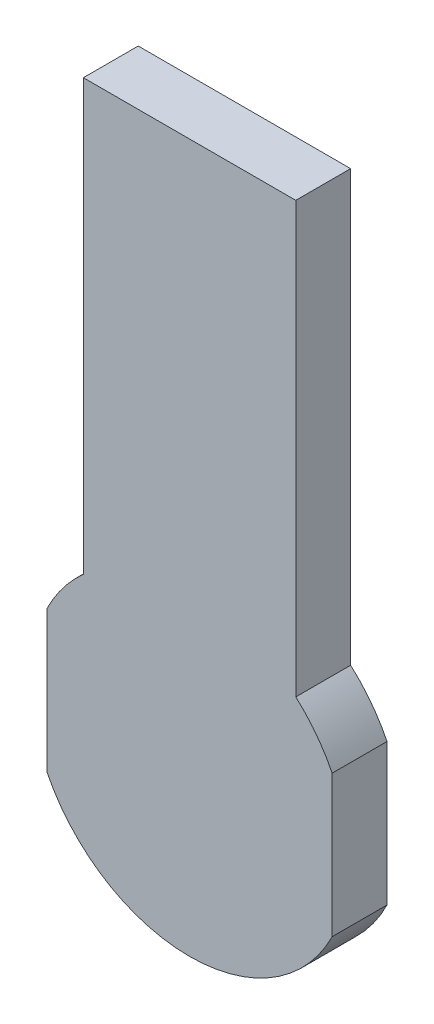
ISO-10303-21;
HEADER;
FILE_DESCRIPTION(('STEP AP214'),'2;1');
FILE_NAME('part.step','',(''),(''),'','','');
FILE_SCHEMA(('AUTOMOTIVE_DESIGN { 1 0 10303 214 1 1 1 1 }'));
ENDSEC;
DATA;
#1=APPLICATION_CONTEXT('core data for automotive mechanical design processes');
#2=APPLICATION_PROTOCOL_DEFINITION('international standard','automotive_design',2000,#1);
#3=PRODUCT_CONTEXT('',#1,'mechanical');
#4=PRODUCT('Part','Part','',(#3));
#5=PRODUCT_RELATED_PRODUCT_CATEGORY('part','',(#4));
#6=PRODUCT_DEFINITION_FORMATION('','',#4);
#7=PRODUCT_DEFINITION_CONTEXT('part definition',#1,'design');
#8=PRODUCT_DEFINITION('design','',#6,#7);
#9=PRODUCT_DEFINITION_SHAPE('','',#8);
#10=(LENGTH_UNIT() NAMED_UNIT(*) SI_UNIT(.MILLI.,.METRE.));
#11=(NAMED_UNIT(*) PLANE_ANGLE_UNIT() SI_UNIT($,.RADIAN.));
#12=(NAMED_UNIT(*) SI_UNIT($,.STERADIAN.) SOLID_ANGLE_UNIT());
#13=UNCERTAINTY_MEASURE_WITH_UNIT(LENGTH_MEASURE(1.E-05),#10,'distance_accuracy_value','');
#14=(GEOMETRIC_REPRESENTATION_CONTEXT(3) GLOBAL_UNCERTAINTY_ASSIGNED_CONTEXT((#13)) GLOBAL_UNIT_ASSIGNED_CONTEXT((#10,
#11,#12)) REPRESENTATION_CONTEXT('',''));
#15=CARTESIAN_POINT('',(0.,0.,0.));
#16=DIRECTION('',(0.,0.,1.));
#17=DIRECTION('',(1.,0.,0.));
#18=AXIS2_PLACEMENT_3D('',#15,#16,#17);
#19=CARTESIAN_POINT('',(0.,0.,-0.15));
#20=DIRECTION('',(0.,0.,-1.));
#21=DIRECTION('',(-1.,0.,0.));
#22=AXIS2_PLACEMENT_3D('',#19,#20,#21);
#23=PLANE('',#22);
#24=DIRECTION('',(0.,1.,0.));
#25=VECTOR('',#24,1.);
#26=CARTESIAN_POINT('',(-0.3,1.55,-0.15));
#27=LINE('',#26,#25);
#28=CARTESIAN_POINT('',(-0.3,0.335108106719704,-0.15));
#29=VERTEX_POINT('',#28);
#30=CARTESIAN_POINT('',(-0.3,1.55,-0.15));
#31=VERTEX_POINT('',#30);
#32=EDGE_CURVE('E112',#29,#31,#27,.T.);
#33=ORIENTED_EDGE('',*,*,#32,.T.);
#34=DIRECTION('',(1.,0.,0.));
#35=VECTOR('',#34,1.);
#36=CARTESIAN_POINT('',(0.3,1.55,-0.15));
#37=LINE('',#36,#35);
#38=CARTESIAN_POINT('',(0.3,1.55,-0.15));
#39=VERTEX_POINT('',#38);
#40=EDGE_CURVE('E107',#31,#39,#37,.T.);
#41=ORIENTED_EDGE('',*,*,#40,.T.);
#42=DIRECTION('',(0.,-1.,0.));
#43=VECTOR('',#42,1.);
#44=CARTESIAN_POINT('',(0.3,1.55,-0.15));
#45=LINE('',#44,#43);
#46=CARTESIAN_POINT('',(0.3,0.335108106719699,-0.15));
#47=VERTEX_POINT('',#46);
#48=EDGE_CURVE('E83',#39,#47,#45,.T.);
#49=ORIENTED_EDGE('',*,*,#48,.T.);
#50=CARTESIAN_POINT('',(0.,0.,-0.15));
#51=DIRECTION('',(0.,0.,-1.));
#52=DIRECTION('',(-1.,0.,0.));
#53=AXIS2_PLACEMENT_3D('',#50,#51,#52);
#54=CIRCLE('',#53,0.449774880567);
#55=CARTESIAN_POINT('',(0.40286156827,0.200000000000116,-0.15));
#56=VERTEX_POINT('',#55);
#57=EDGE_CURVE('E20',#56,#47,#54,.F.);
#58=ORIENTED_EDGE('',*,*,#57,.F.);
#59=DIRECTION('',(0.,1.,0.));
#60=VECTOR('',#59,1.);
#61=CARTESIAN_POINT('',(0.40286156827,0.2,-0.15));
#62=LINE('',#61,#60);
#63=CARTESIAN_POINT('',(0.402861568270044,-0.200000000000133,-0.15));
#64=VERTEX_POINT('',#63);
#65=EDGE_CURVE('E81',#56,#64,#62,.F.);
#66=ORIENTED_EDGE('',*,*,#65,.T.);
#67=CARTESIAN_POINT('',(0.,0.,-0.15));
#68=DIRECTION('',(0.,0.,-1.));
#69=DIRECTION('',(-1.,0.,0.));
#70=AXIS2_PLACEMENT_3D('',#67,#68,#69);
#71=CIRCLE('',#70,0.449774880567);
#72=CARTESIAN_POINT('',(-0.402861568271,-0.199999999999115,-0.15));
#73=VERTEX_POINT('',#72);
#74=EDGE_CURVE('E94',#73,#64,#71,.F.);
#75=ORIENTED_EDGE('',*,*,#74,.F.);
#76=DIRECTION('',(0.,1.,0.));
#77=VECTOR('',#76,1.);
#78=CARTESIAN_POINT('',(-0.402861568271,0.2,-0.15));
#79=LINE('',#78,#77);
#80=CARTESIAN_POINT('',(-0.40286156827065,0.199999999998947,-0.15));
#81=VERTEX_POINT('',#80);
#82=EDGE_CURVE('E117',#73,#81,#79,.T.);
#83=ORIENTED_EDGE('',*,*,#82,.T.);
#84=CARTESIAN_POINT('',(0.,0.,-0.15));
#85=DIRECTION('',(0.,0.,-1.));
#86=DIRECTION('',(-1.,0.,0.));
#87=AXIS2_PLACEMENT_3D('',#84,#85,#86);
#88=CIRCLE('',#87,0.449774880567);
#89=EDGE_CURVE('E119',#29,#81,#88,.F.);
#90=ORIENTED_EDGE('',*,*,#89,.F.);
#91=EDGE_LOOP('',(#33,#41,#49,#58,#66,#75,#83,#90));
#92=FACE_BOUND('',#91,.T.);
#93=ADVANCED_FACE('F17',(#92),#23,.T.);
#94=CARTESIAN_POINT('',(0.,0.,0.005));
#95=DIRECTION('',(0.,0.,-1.));
#96=DIRECTION('',(-1.,0.,0.));
#97=AXIS2_PLACEMENT_3D('',#94,#95,#96);
#98=CYLINDRICAL_SURFACE('',#97,0.449774880567);
#99=DIRECTION('',(0.,0.,1.));
#100=VECTOR('',#99,1.);
#101=CARTESIAN_POINT('',(0.3,0.33510810672,0.005));
#102=LINE('',#101,#100);
#103=CARTESIAN_POINT('',(0.3,0.335108106719699,0.005));
#104=VERTEX_POINT('',#103);
#105=EDGE_CURVE('E104',#47,#104,#102,.T.);
#106=ORIENTED_EDGE('',*,*,#105,.T.);
#107=CARTESIAN_POINT('',(0.,0.,0.005));
#108=DIRECTION('',(0.,0.,-1.));
#109=DIRECTION('',(-1.,0.,0.));
#110=AXIS2_PLACEMENT_3D('',#107,#108,#109);
#111=CIRCLE('',#110,0.449774880567);
#112=CARTESIAN_POINT('',(0.40286156827,0.200000000000116,0.005));
#113=VERTEX_POINT('',#112);
#114=EDGE_CURVE('E98',#104,#113,#111,.T.);
#115=ORIENTED_EDGE('',*,*,#114,.T.);
#116=DIRECTION('',(0.,0.,1.));
#117=VECTOR('',#116,1.);
#118=CARTESIAN_POINT('',(0.40286156827,0.2,0.005));
#119=LINE('',#118,#117);
#120=EDGE_CURVE('E88',#113,#56,#119,.F.);
#121=ORIENTED_EDGE('',*,*,#120,.T.);
#122=ORIENTED_EDGE('',*,*,#57,.T.);
#123=EDGE_LOOP('',(#106,#115,#121,#122));
#124=FACE_BOUND('',#123,.T.);
#125=ADVANCED_FACE('F97',(#124),#98,.T.);
#126=CARTESIAN_POINT('',(0.40286156827,0.2,0.005));
#127=DIRECTION('',(-1.,0.,0.));
#128=DIRECTION('',(0.,0.,1.));
#129=AXIS2_PLACEMENT_3D('',#126,#127,#128);
#130=PLANE('',#129);
#131=ORIENTED_EDGE('',*,*,#65,.F.);
#132=ORIENTED_EDGE('',*,*,#120,.F.);
#133=DIRECTION('',(0.,1.,0.));
#134=VECTOR('',#133,1.);
#135=CARTESIAN_POINT('',(0.40286156827,0.,0.005));
#136=LINE('',#135,#134);
#137=CARTESIAN_POINT('',(0.402861568270044,-0.200000000000133,0.005));
#138=VERTEX_POINT('',#137);
#139=EDGE_CURVE('E130',#113,#138,#136,.F.);
#140=ORIENTED_EDGE('',*,*,#139,.T.);
#141=DIRECTION('',(0.,0.,-1.));
#142=VECTOR('',#141,1.);
#143=CARTESIAN_POINT('',(0.402861568270089,-0.200000000000044,0.005));
#144=LINE('',#143,#142);
#145=EDGE_CURVE('E93',#64,#138,#144,.F.);
#146=ORIENTED_EDGE('',*,*,#145,.F.);
#147=EDGE_LOOP('',(#131,#132,#140,#146));
#148=FACE_BOUND('',#147,.T.);
#149=ADVANCED_FACE('F90',(#148),#130,.F.);
#150=CARTESIAN_POINT('',(0.,0.,0.005));
#151=DIRECTION('',(0.,0.,-1.));
#152=DIRECTION('',(-1.,0.,0.));
#153=AXIS2_PLACEMENT_3D('',#150,#151,#152);
#154=CYLINDRICAL_SURFACE('',#153,0.449774880567);
#155=ORIENTED_EDGE('',*,*,#145,.T.);
#156=CARTESIAN_POINT('',(0.,0.,0.005));
#157=DIRECTION('',(0.,0.,-1.));
#158=DIRECTION('',(-1.,0.,0.));
#159=AXIS2_PLACEMENT_3D('',#156,#157,#158);
#160=CIRCLE('',#159,0.449774880567);
#161=CARTESIAN_POINT('',(-0.402861568271,-0.199999999999115,0.005));
#162=VERTEX_POINT('',#161);
#163=EDGE_CURVE('E127',#138,#162,#160,.T.);
#164=ORIENTED_EDGE('',*,*,#163,.T.);
#165=DIRECTION('',(0.,0.,1.));
#166=VECTOR('',#165,1.);
#167=CARTESIAN_POINT('',(-0.402861568271,-0.2,0.005));
#168=LINE('',#167,#166);
#169=EDGE_CURVE('E120',#162,#73,#168,.F.);
#170=ORIENTED_EDGE('',*,*,#169,.T.);
#171=ORIENTED_EDGE('',*,*,#74,.T.);
#172=EDGE_LOOP('',(#155,#164,#170,#171));
#173=FACE_BOUND('',#172,.T.);
#174=ADVANCED_FACE('F175',(#173),#154,.T.);
#175=CARTESIAN_POINT('',(-0.402861568271,0.2,0.005));
#176=DIRECTION('',(1.,0.,0.));
#177=DIRECTION('',(0.,1.,0.));
#178=AXIS2_PLACEMENT_3D('',#175,#176,#177);
#179=PLANE('',#178);
#180=ORIENTED_EDGE('',*,*,#82,.F.);
#181=ORIENTED_EDGE('',*,*,#169,.F.);
#182=DIRECTION('',(0.,1.,0.));
#183=VECTOR('',#182,1.);
#184=CARTESIAN_POINT('',(-0.402861568271,0.,0.005));
#185=LINE('',#184,#183);
#186=CARTESIAN_POINT('',(-0.40286156827065,0.199999999998947,0.005));
#187=VERTEX_POINT('',#186);
#188=EDGE_CURVE('E126',#162,#187,#185,.T.);
#189=ORIENTED_EDGE('',*,*,#188,.T.);
#190=DIRECTION('',(0.,0.,-1.));
#191=VECTOR('',#190,1.);
#192=CARTESIAN_POINT('',(-0.4028615682703,0.199999999999652,0.005));
#193=LINE('',#192,#191);
#194=EDGE_CURVE('E132',#81,#187,#193,.F.);
#195=ORIENTED_EDGE('',*,*,#194,.F.);
#196=EDGE_LOOP('',(#180,#181,#189,#195));
#197=FACE_BOUND('',#196,.T.);
#198=ADVANCED_FACE('F174',(#197),#179,.F.);
#199=CARTESIAN_POINT('',(0.,0.,0.005));
#200=DIRECTION('',(0.,0.,-1.));
#201=DIRECTION('',(-1.,0.,0.));
#202=AXIS2_PLACEMENT_3D('',#199,#200,#201);
#203=CYLINDRICAL_SURFACE('',#202,0.449774880567);
#204=ORIENTED_EDGE('',*,*,#194,.T.);
#205=CARTESIAN_POINT('',(0.,0.,0.005));
#206=DIRECTION('',(0.,0.,-1.));
#207=DIRECTION('',(-1.,0.,0.));
#208=AXIS2_PLACEMENT_3D('',#205,#206,#207);
#209=CIRCLE('',#208,0.449774880567);
#210=CARTESIAN_POINT('',(-0.3,0.335108106719704,0.005));
#211=VERTEX_POINT('',#210);
#212=EDGE_CURVE('E122',#187,#211,#209,.T.);
#213=ORIENTED_EDGE('',*,*,#212,.T.);
#214=DIRECTION('',(0.,0.,1.));
#215=VECTOR('',#214,1.);
#216=CARTESIAN_POINT('',(-0.3,0.33510810672,0.005));
#217=LINE('',#216,#215);
#218=EDGE_CURVE('E114',#211,#29,#217,.F.);
#219=ORIENTED_EDGE('',*,*,#218,.T.);
#220=ORIENTED_EDGE('',*,*,#89,.T.);
#221=EDGE_LOOP('',(#204,#213,#219,#220));
#222=FACE_BOUND('',#221,.T.);
#223=ADVANCED_FACE('F170',(#222),#203,.T.);
#224=CARTESIAN_POINT('',(-0.3,1.55,0.005));
#225=DIRECTION('',(1.,0.,0.));
#226=DIRECTION('',(0.,1.,0.));
#227=AXIS2_PLACEMENT_3D('',#224,#225,#226);
#228=PLANE('',#227);
#229=ORIENTED_EDGE('',*,*,#32,.F.);
#230=ORIENTED_EDGE('',*,*,#218,.F.);
#231=DIRECTION('',(0.,1.,0.));
#232=VECTOR('',#231,1.);
#233=CARTESIAN_POINT('',(-0.3,0.,0.005));
#234=LINE('',#233,#232);
#235=CARTESIAN_POINT('',(-0.3,1.55,0.005));
#236=VERTEX_POINT('',#235);
#237=EDGE_CURVE('E125',#211,#236,#234,.T.);
#238=ORIENTED_EDGE('',*,*,#237,.T.);
#239=DIRECTION('',(0.,0.,-1.));
#240=VECTOR('',#239,1.);
#241=CARTESIAN_POINT('',(-0.3,1.55,0.005));
#242=LINE('',#241,#240);
#243=EDGE_CURVE('E109',#236,#31,#242,.T.);
#244=ORIENTED_EDGE('',*,*,#243,.T.);
#245=EDGE_LOOP('',(#229,#230,#238,#244));
#246=FACE_BOUND('',#245,.T.);
#247=ADVANCED_FACE('F163',(#246),#228,.F.);
#248=CARTESIAN_POINT('',(0.3,1.55,0.005));
#249=DIRECTION('',(0.,-1.,0.));
#250=DIRECTION('',(0.,0.,-1.));
#251=AXIS2_PLACEMENT_3D('',#248,#249,#250);
#252=PLANE('',#251);
#253=ORIENTED_EDGE('',*,*,#40,.F.);
#254=ORIENTED_EDGE('',*,*,#243,.F.);
#255=DIRECTION('',(-1.,0.,0.));
#256=VECTOR('',#255,1.);
#257=CARTESIAN_POINT('',(0.,1.55,0.005));
#258=LINE('',#257,#256);
#259=CARTESIAN_POINT('',(0.3,1.55,0.005));
#260=VERTEX_POINT('',#259);
#261=EDGE_CURVE('E26',#236,#260,#258,.F.);
#262=ORIENTED_EDGE('',*,*,#261,.T.);
#263=DIRECTION('',(0.,0.,1.));
#264=VECTOR('',#263,1.);
#265=CARTESIAN_POINT('',(0.3,1.55,0.005));
#266=LINE('',#265,#264);
#267=EDGE_CURVE('E34',#260,#39,#266,.F.);
#268=ORIENTED_EDGE('',*,*,#267,.T.);
#269=EDGE_LOOP('',(#253,#254,#262,#268));
#270=FACE_BOUND('',#269,.T.);
#271=ADVANCED_FACE('F191',(#270),#252,.F.);
#272=CARTESIAN_POINT('',(0.3,1.55,0.005));
#273=DIRECTION('',(-1.,0.,0.));
#274=DIRECTION('',(0.,-1.,0.));
#275=AXIS2_PLACEMENT_3D('',#272,#273,#274);
#276=PLANE('',#275);
#277=ORIENTED_EDGE('',*,*,#48,.F.);
#278=ORIENTED_EDGE('',*,*,#267,.F.);
#279=DIRECTION('',(0.,1.,0.));
#280=VECTOR('',#279,1.);
#281=CARTESIAN_POINT('',(0.3,0.,0.005));
#282=LINE('',#281,#280);
#283=EDGE_CURVE('E11',#260,#104,#282,.F.);
#284=ORIENTED_EDGE('',*,*,#283,.T.);
#285=ORIENTED_EDGE('',*,*,#105,.F.);
#286=EDGE_LOOP('',(#277,#278,#284,#285));
#287=FACE_BOUND('',#286,.T.);
#288=ADVANCED_FACE('F186',(#287),#276,.F.);
#289=CARTESIAN_POINT('',(0.,0.,0.005));
#290=DIRECTION('',(0.,0.,-1.));
#291=DIRECTION('',(-1.,0.,0.));
#292=AXIS2_PLACEMENT_3D('',#289,#290,#291);
#293=PLANE('',#292);
#294=ORIENTED_EDGE('',*,*,#261,.F.);
#295=ORIENTED_EDGE('',*,*,#237,.F.);
#296=ORIENTED_EDGE('',*,*,#212,.F.);
#297=ORIENTED_EDGE('',*,*,#188,.F.);
#298=ORIENTED_EDGE('',*,*,#163,.F.);
#299=ORIENTED_EDGE('',*,*,#139,.F.);
#300=ORIENTED_EDGE('',*,*,#114,.F.);
#301=ORIENTED_EDGE('',*,*,#283,.F.);
#302=EDGE_LOOP('',(#294,#295,#296,#297,#298,#299,#300,#301));
#303=FACE_BOUND('',#302,.T.);
#304=ADVANCED_FACE('F167',(#303),#293,.F.);
#305=CLOSED_SHELL('',(#93,#125,#149,#174,#198,#223,#247,#271,#288,#304));
#306=MANIFOLD_SOLID_BREP('B1',#305);
#307=ADVANCED_BREP_SHAPE_REPRESENTATION('',(#18,#306),#14);
#308=SHAPE_DEFINITION_REPRESENTATION(#9,#307);
ENDSEC;
END-ISO-10303-21;
